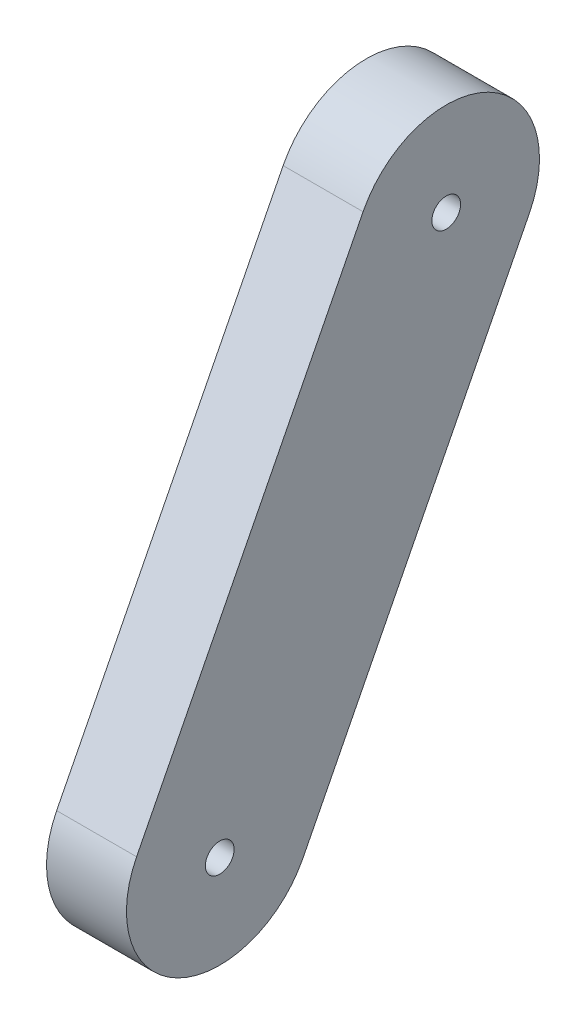
ISO-10303-21;
HEADER;
FILE_DESCRIPTION(('STEP AP214'),'2;1');
FILE_NAME('part.step','',(''),(''),'','','');
FILE_SCHEMA(('AUTOMOTIVE_DESIGN { 1 0 10303 214 1 1 1 1 }'));
ENDSEC;
DATA;
#1=APPLICATION_CONTEXT('core data for automotive mechanical design processes');
#2=APPLICATION_PROTOCOL_DEFINITION('international standard','automotive_design',2000,#1);
#3=PRODUCT_CONTEXT('',#1,'mechanical');
#4=PRODUCT('Part','Part','',(#3));
#5=PRODUCT_RELATED_PRODUCT_CATEGORY('part','',(#4));
#6=PRODUCT_DEFINITION_FORMATION('','',#4);
#7=PRODUCT_DEFINITION_CONTEXT('part definition',#1,'design');
#8=PRODUCT_DEFINITION('design','',#6,#7);
#9=PRODUCT_DEFINITION_SHAPE('','',#8);
#10=(LENGTH_UNIT() NAMED_UNIT(*) SI_UNIT(.MILLI.,.METRE.));
#11=(NAMED_UNIT(*) PLANE_ANGLE_UNIT() SI_UNIT($,.RADIAN.));
#12=(NAMED_UNIT(*) SI_UNIT($,.STERADIAN.) SOLID_ANGLE_UNIT());
#13=UNCERTAINTY_MEASURE_WITH_UNIT(LENGTH_MEASURE(1.E-05),#10,'distance_accuracy_value','');
#14=(GEOMETRIC_REPRESENTATION_CONTEXT(3) GLOBAL_UNCERTAINTY_ASSIGNED_CONTEXT((#13)) GLOBAL_UNIT_ASSIGNED_CONTEXT((#10,
#11,#12)) REPRESENTATION_CONTEXT('',''));
#15=CARTESIAN_POINT('',(0.,0.,0.));
#16=DIRECTION('',(0.,0.,1.));
#17=DIRECTION('',(1.,0.,0.));
#18=AXIS2_PLACEMENT_3D('',#15,#16,#17);
#19=CARTESIAN_POINT('',(12.827,-82.55,812.8));
#20=DIRECTION('',(1.,0.,0.));
#21=DIRECTION('',(0.,1.,0.));
#22=AXIS2_PLACEMENT_3D('',#19,#20,#21);
#23=PLANE('',#22);
#24=CARTESIAN_POINT('',(12.827,-82.55,812.8));
#25=DIRECTION('',(-1.,0.,0.));
#26=DIRECTION('',(0.,1.,0.));
#27=AXIS2_PLACEMENT_3D('',#24,#25,#26);
#28=CIRCLE('',#27,44.45);
#29=CARTESIAN_POINT('',(12.827,-62.4014943280687,852.421209209061));
#30=VERTEX_POINT('',#29);
#31=CARTESIAN_POINT('',(12.827,-102.698505671931,773.178790790939));
#32=VERTEX_POINT('',#31);
#33=EDGE_CURVE('E91',#30,#32,#28,.T.);
#34=ORIENTED_EDGE('',*,*,#33,.T.);
#35=DIRECTION('',(0.,-0.891365786480554,0.453284717028826));
#36=VECTOR('',#35,1.);
#37=CARTESIAN_POINT('',(12.827,-102.698505671931,773.178790790939));
#38=LINE('',#37,#36);
#39=CARTESIAN_POINT('',(12.8270000000001,-314.954983577613,881.117214033429));
#40=VERTEX_POINT('',#39);
#41=EDGE_CURVE('E86',#32,#40,#38,.T.);
#42=ORIENTED_EDGE('',*,*,#41,.T.);
#43=CARTESIAN_POINT('',(12.8270000000001,-294.806477905682,920.738423242489));
#44=DIRECTION('',(-1.,0.,0.));
#45=DIRECTION('',(0.,-1.,0.));
#46=AXIS2_PLACEMENT_3D('',#43,#44,#45);
#47=CIRCLE('',#46,44.45);
#48=CARTESIAN_POINT('',(12.8270000000001,-274.657972233751,960.35963245155));
#49=VERTEX_POINT('',#48);
#50=EDGE_CURVE('E89',#40,#49,#47,.T.);
#51=ORIENTED_EDGE('',*,*,#50,.T.);
#52=DIRECTION('',(0.,0.891365786480554,-0.453284717028826));
#53=VECTOR('',#52,1.);
#54=CARTESIAN_POINT('',(12.827,-62.4014943280687,852.421209209061));
#55=LINE('',#54,#53);
#56=EDGE_CURVE('E56',#49,#30,#55,.T.);
#57=ORIENTED_EDGE('',*,*,#56,.T.);
#58=EDGE_LOOP('',(#34,#42,#51,#57));
#59=FACE_BOUND('',#58,.T.);
#60=CARTESIAN_POINT('',(12.8270000000001,-294.806477905682,920.738423242489));
#61=DIRECTION('',(-1.,0.,0.));
#62=DIRECTION('',(0.,-1.,0.));
#63=AXIS2_PLACEMENT_3D('',#60,#61,#62);
#64=CIRCLE('',#63,6.84999999999997);
#65=CARTESIAN_POINT('',(12.8270000000001,-287.956477905682,920.738423242489));
#66=VERTEX_POINT('',#65);
#67=EDGE_CURVE('E106',#66,#66,#64,.T.);
#68=ORIENTED_EDGE('',*,*,#67,.F.);
#69=EDGE_LOOP('',(#68));
#70=FACE_BOUND('',#69,.T.);
#71=CARTESIAN_POINT('',(12.827,-82.55,812.8));
#72=DIRECTION('',(-1.,0.,0.));
#73=DIRECTION('',(0.,-1.,0.));
#74=AXIS2_PLACEMENT_3D('',#71,#72,#73);
#75=CIRCLE('',#74,6.84999999999997);
#76=CARTESIAN_POINT('',(12.827,-75.7,812.8));
#77=VERTEX_POINT('',#76);
#78=EDGE_CURVE('E121',#77,#77,#75,.T.);
#79=ORIENTED_EDGE('',*,*,#78,.F.);
#80=EDGE_LOOP('',(#79));
#81=FACE_BOUND('',#80,.T.);
#82=ADVANCED_FACE('F39',(#59,#70,#81),#23,.F.);
#83=CARTESIAN_POINT('',(50.927,-82.55,812.8));
#84=DIRECTION('',(1.,0.,0.));
#85=DIRECTION('',(0.,1.,0.));
#86=AXIS2_PLACEMENT_3D('',#83,#84,#85);
#87=PLANE('',#86);
#88=CARTESIAN_POINT('',(50.9270000000001,-294.806477905682,920.738423242489));
#89=DIRECTION('',(-1.,0.,0.));
#90=DIRECTION('',(0.,-1.,0.));
#91=AXIS2_PLACEMENT_3D('',#88,#89,#90);
#92=CIRCLE('',#91,6.84999999999997);
#93=CARTESIAN_POINT('',(50.9270000000001,-287.956477905682,920.738423242489));
#94=VERTEX_POINT('',#93);
#95=EDGE_CURVE('E118',#94,#94,#92,.T.);
#96=ORIENTED_EDGE('',*,*,#95,.T.);
#97=EDGE_LOOP('',(#96));
#98=FACE_BOUND('',#97,.T.);
#99=CARTESIAN_POINT('',(50.927,-82.55,812.8));
#100=DIRECTION('',(-1.,0.,0.));
#101=DIRECTION('',(0.,1.,0.));
#102=AXIS2_PLACEMENT_3D('',#99,#100,#101);
#103=CIRCLE('',#102,44.45);
#104=CARTESIAN_POINT('',(50.927,-62.4014943280686,852.421209209061));
#105=VERTEX_POINT('',#104);
#106=CARTESIAN_POINT('',(50.927,-102.698505671931,773.178790790939));
#107=VERTEX_POINT('',#106);
#108=EDGE_CURVE('E103',#105,#107,#103,.T.);
#109=ORIENTED_EDGE('',*,*,#108,.F.);
#110=DIRECTION('',(0.,0.891365786480554,-0.453284717028826));
#111=VECTOR('',#110,1.);
#112=CARTESIAN_POINT('',(50.927,-62.4014943280686,852.421209209061));
#113=LINE('',#112,#111);
#114=CARTESIAN_POINT('',(50.9270000000001,-274.657972233751,960.35963245155));
#115=VERTEX_POINT('',#114);
#116=EDGE_CURVE('E79',#115,#105,#113,.T.);
#117=ORIENTED_EDGE('',*,*,#116,.F.);
#118=CARTESIAN_POINT('',(50.9270000000001,-294.806477905682,920.738423242489));
#119=DIRECTION('',(-1.,0.,0.));
#120=DIRECTION('',(0.,-1.,0.));
#121=AXIS2_PLACEMENT_3D('',#118,#119,#120);
#122=CIRCLE('',#121,44.45);
#123=CARTESIAN_POINT('',(50.9270000000001,-314.954983577613,881.117214033429));
#124=VERTEX_POINT('',#123);
#125=EDGE_CURVE('E73',#124,#115,#122,.T.);
#126=ORIENTED_EDGE('',*,*,#125,.F.);
#127=DIRECTION('',(0.,-0.891365786480554,0.453284717028826));
#128=VECTOR('',#127,1.);
#129=CARTESIAN_POINT('',(50.927,-102.698505671931,773.178790790939));
#130=LINE('',#129,#128);
#131=EDGE_CURVE('E95',#107,#124,#130,.T.);
#132=ORIENTED_EDGE('',*,*,#131,.F.);
#133=EDGE_LOOP('',(#109,#117,#126,#132));
#134=FACE_BOUND('',#133,.T.);
#135=CARTESIAN_POINT('',(50.927,-82.55,812.8));
#136=DIRECTION('',(-1.,0.,0.));
#137=DIRECTION('',(0.,-1.,0.));
#138=AXIS2_PLACEMENT_3D('',#135,#136,#137);
#139=CIRCLE('',#138,6.84999999999997);
#140=CARTESIAN_POINT('',(50.927,-75.7,812.8));
#141=VERTEX_POINT('',#140);
#142=EDGE_CURVE('E124',#141,#141,#139,.T.);
#143=ORIENTED_EDGE('',*,*,#142,.T.);
#144=EDGE_LOOP('',(#143));
#145=FACE_BOUND('',#144,.T.);
#146=ADVANCED_FACE('F114',(#98,#134,#145),#87,.T.);
#147=CARTESIAN_POINT('',(12.827,-82.55,812.8));
#148=DIRECTION('',(1.,0.,0.));
#149=DIRECTION('',(0.,1.,0.));
#150=AXIS2_PLACEMENT_3D('',#147,#148,#149);
#151=CYLINDRICAL_SURFACE('',#150,44.45);
#152=ORIENTED_EDGE('',*,*,#108,.T.);
#153=DIRECTION('',(1.,0.,0.));
#154=VECTOR('',#153,1.);
#155=CARTESIAN_POINT('',(12.827,-102.698505671931,773.178790790939));
#156=LINE('',#155,#154);
#157=EDGE_CURVE('E11',#32,#107,#156,.T.);
#158=ORIENTED_EDGE('',*,*,#157,.F.);
#159=ORIENTED_EDGE('',*,*,#33,.F.);
#160=DIRECTION('',(1.,0.,0.));
#161=VECTOR('',#160,1.);
#162=CARTESIAN_POINT('',(12.827,-62.4014943280687,852.421209209061));
#163=LINE('',#162,#161);
#164=EDGE_CURVE('E99',#30,#105,#163,.T.);
#165=ORIENTED_EDGE('',*,*,#164,.T.);
#166=EDGE_LOOP('',(#152,#158,#159,#165));
#167=FACE_BOUND('',#166,.T.);
#168=ADVANCED_FACE('F41',(#167),#151,.T.);
#169=CARTESIAN_POINT('',(12.827,-102.698505671931,773.178790790939));
#170=DIRECTION('',(0.,0.453284717028826,0.891365786480554));
#171=DIRECTION('',(0.,-0.891365786480554,0.453284717028826));
#172=AXIS2_PLACEMENT_3D('',#169,#170,#171);
#173=PLANE('',#172);
#174=ORIENTED_EDGE('',*,*,#131,.T.);
#175=DIRECTION('',(1.,0.,0.));
#176=VECTOR('',#175,1.);
#177=CARTESIAN_POINT('',(12.8270000000001,-314.954983577613,881.117214033429));
#178=LINE('',#177,#176);
#179=EDGE_CURVE('E48',#40,#124,#178,.T.);
#180=ORIENTED_EDGE('',*,*,#179,.F.);
#181=ORIENTED_EDGE('',*,*,#41,.F.);
#182=ORIENTED_EDGE('',*,*,#157,.T.);
#183=EDGE_LOOP('',(#174,#180,#181,#182));
#184=FACE_BOUND('',#183,.T.);
#185=ADVANCED_FACE('F94',(#184),#173,.F.);
#186=CARTESIAN_POINT('',(12.8270000000001,-294.806477905682,920.738423242489));
#187=DIRECTION('',(1.,0.,0.));
#188=DIRECTION('',(0.,1.,0.));
#189=AXIS2_PLACEMENT_3D('',#186,#187,#188);
#190=CYLINDRICAL_SURFACE('',#189,44.45);
#191=ORIENTED_EDGE('',*,*,#125,.T.);
#192=DIRECTION('',(1.,0.,0.));
#193=VECTOR('',#192,1.);
#194=CARTESIAN_POINT('',(12.8270000000001,-274.657972233751,960.35963245155));
#195=LINE('',#194,#193);
#196=EDGE_CURVE('E96',#49,#115,#195,.T.);
#197=ORIENTED_EDGE('',*,*,#196,.F.);
#198=ORIENTED_EDGE('',*,*,#50,.F.);
#199=ORIENTED_EDGE('',*,*,#179,.T.);
#200=EDGE_LOOP('',(#191,#197,#198,#199));
#201=FACE_BOUND('',#200,.T.);
#202=ADVANCED_FACE('F97',(#201),#190,.T.);
#203=CARTESIAN_POINT('',(12.827,-62.4014943280687,852.421209209061));
#204=DIRECTION('',(0.,-0.453284717028826,-0.891365786480554));
#205=DIRECTION('',(0.,0.891365786480554,-0.453284717028826));
#206=AXIS2_PLACEMENT_3D('',#203,#204,#205);
#207=PLANE('',#206);
#208=ORIENTED_EDGE('',*,*,#116,.T.);
#209=ORIENTED_EDGE('',*,*,#164,.F.);
#210=ORIENTED_EDGE('',*,*,#56,.F.);
#211=ORIENTED_EDGE('',*,*,#196,.T.);
#212=EDGE_LOOP('',(#208,#209,#210,#211));
#213=FACE_BOUND('',#212,.T.);
#214=ADVANCED_FACE('F111',(#213),#207,.F.);
#215=CARTESIAN_POINT('',(12.8270000000001,-294.806477905682,920.738423242489));
#216=DIRECTION('',(1.,0.,0.));
#217=DIRECTION('',(0.,1.,0.));
#218=AXIS2_PLACEMENT_3D('',#215,#216,#217);
#219=CYLINDRICAL_SURFACE('',#218,6.84999999999997);
#220=CARTESIAN_POINT('',(12.8270000000001,-287.956477905682,920.738423242489));
#221=CARTESIAN_POINT('',(13.2238750000001,-287.956477905682,920.738423242489));
#222=CARTESIAN_POINT('',(13.6207500000001,-287.956477905682,920.738423242489));
#223=CARTESIAN_POINT('',(14.4145000000001,-287.956477905682,920.738423242489));
#224=CARTESIAN_POINT('',(14.8113750000001,-287.956477905682,920.738423242489));
#225=CARTESIAN_POINT('',(15.6051250000001,-287.956477905682,920.738423242489));
#226=CARTESIAN_POINT('',(16.0020000000001,-287.956477905682,920.738423242489));
#227=CARTESIAN_POINT('',(16.7957500000001,-287.956477905682,920.738423242489));
#228=CARTESIAN_POINT('',(17.1926250000001,-287.956477905682,920.738423242489));
#229=CARTESIAN_POINT('',(17.9863750000001,-287.956477905682,920.738423242489));
#230=CARTESIAN_POINT('',(18.3832500000001,-287.956477905682,920.738423242489));
#231=CARTESIAN_POINT('',(19.1770000000001,-287.956477905682,920.738423242489));
#232=CARTESIAN_POINT('',(19.5738750000001,-287.956477905682,920.738423242489));
#233=CARTESIAN_POINT('',(20.3676250000001,-287.956477905682,920.738423242489));
#234=CARTESIAN_POINT('',(20.7645000000001,-287.956477905682,920.738423242489));
#235=CARTESIAN_POINT('',(21.5582500000001,-287.956477905682,920.738423242489));
#236=CARTESIAN_POINT('',(21.9551250000001,-287.956477905682,920.738423242489));
#237=CARTESIAN_POINT('',(22.7488750000001,-287.956477905682,920.738423242489));
#238=CARTESIAN_POINT('',(23.1457500000001,-287.956477905682,920.738423242489));
#239=CARTESIAN_POINT('',(23.9395000000001,-287.956477905682,920.738423242489));
#240=CARTESIAN_POINT('',(24.3363750000001,-287.956477905682,920.738423242489));
#241=CARTESIAN_POINT('',(25.1301250000001,-287.956477905682,920.738423242489));
#242=CARTESIAN_POINT('',(25.5270000000001,-287.956477905682,920.738423242489));
#243=CARTESIAN_POINT('',(26.3207500000001,-287.956477905682,920.738423242489));
#244=CARTESIAN_POINT('',(26.7176250000001,-287.956477905682,920.738423242489));
#245=CARTESIAN_POINT('',(27.5113750000001,-287.956477905682,920.738423242489));
#246=CARTESIAN_POINT('',(27.9082500000001,-287.956477905682,920.738423242489));
#247=CARTESIAN_POINT('',(28.7020000000001,-287.956477905682,920.738423242489));
#248=CARTESIAN_POINT('',(29.0988750000001,-287.956477905682,920.738423242489));
#249=CARTESIAN_POINT('',(29.8926250000001,-287.956477905682,920.738423242489));
#250=CARTESIAN_POINT('',(30.2895000000001,-287.956477905682,920.738423242489));
#251=CARTESIAN_POINT('',(31.0832500000001,-287.956477905682,920.738423242489));
#252=CARTESIAN_POINT('',(31.4801250000001,-287.956477905682,920.738423242489));
#253=CARTESIAN_POINT('',(32.2738750000001,-287.956477905682,920.738423242489));
#254=CARTESIAN_POINT('',(32.6707500000001,-287.956477905682,920.738423242489));
#255=CARTESIAN_POINT('',(33.4645000000001,-287.956477905682,920.738423242489));
#256=CARTESIAN_POINT('',(33.8613750000001,-287.956477905682,920.738423242489));
#257=CARTESIAN_POINT('',(34.6551250000001,-287.956477905682,920.738423242489));
#258=CARTESIAN_POINT('',(35.0520000000001,-287.956477905682,920.738423242489));
#259=CARTESIAN_POINT('',(35.8457500000001,-287.956477905682,920.738423242489));
#260=CARTESIAN_POINT('',(36.2426250000001,-287.956477905682,920.738423242489));
#261=CARTESIAN_POINT('',(37.0363750000001,-287.956477905682,920.738423242489));
#262=CARTESIAN_POINT('',(37.4332500000001,-287.956477905682,920.738423242489));
#263=CARTESIAN_POINT('',(38.2270000000001,-287.956477905682,920.738423242489));
#264=CARTESIAN_POINT('',(38.6238750000001,-287.956477905682,920.738423242489));
#265=CARTESIAN_POINT('',(39.4176250000001,-287.956477905682,920.738423242489));
#266=CARTESIAN_POINT('',(39.8145000000001,-287.956477905682,920.738423242489));
#267=CARTESIAN_POINT('',(40.6082500000001,-287.956477905682,920.738423242489));
#268=CARTESIAN_POINT('',(41.0051250000001,-287.956477905682,920.738423242489));
#269=CARTESIAN_POINT('',(41.7988750000001,-287.956477905682,920.738423242489));
#270=CARTESIAN_POINT('',(42.1957500000001,-287.956477905682,920.738423242489));
#271=CARTESIAN_POINT('',(42.9895000000001,-287.956477905682,920.738423242489));
#272=CARTESIAN_POINT('',(43.3863750000001,-287.956477905682,920.738423242489));
#273=CARTESIAN_POINT('',(44.1801250000001,-287.956477905682,920.738423242489));
#274=CARTESIAN_POINT('',(44.5770000000001,-287.956477905682,920.738423242489));
#275=CARTESIAN_POINT('',(45.3707500000001,-287.956477905682,920.738423242489));
#276=CARTESIAN_POINT('',(45.7676250000001,-287.956477905682,920.738423242489));
#277=CARTESIAN_POINT('',(46.5613750000001,-287.956477905682,920.738423242489));
#278=CARTESIAN_POINT('',(46.9582500000001,-287.956477905682,920.738423242489));
#279=CARTESIAN_POINT('',(47.7520000000001,-287.956477905682,920.738423242489));
#280=CARTESIAN_POINT('',(48.1488750000001,-287.956477905682,920.738423242489));
#281=CARTESIAN_POINT('',(48.9426250000001,-287.956477905682,920.738423242489));
#282=CARTESIAN_POINT('',(49.3395000000001,-287.956477905682,920.738423242489));
#283=CARTESIAN_POINT('',(50.1332500000001,-287.956477905682,920.738423242489));
#284=CARTESIAN_POINT('',(50.5301250000001,-287.956477905682,920.738423242489));
#285=CARTESIAN_POINT('',(50.9270000000001,-287.956477905682,920.738423242489));
#286=B_SPLINE_CURVE_WITH_KNOTS('',3,(#220,#221,#222,#223,#224,#225,#226,#227,#228,#229,#230,
#231,#232,#233,#234,#235,#236,#237,#238,#239,#240,#241,#242,#243,#244,#245,#246,#247,#248,#249,
#250,#251,#252,#253,#254,#255,#256,#257,#258,#259,#260,#261,#262,#263,#264,#265,#266,#267,#268,
#269,#270,#271,#272,#273,#274,#275,#276,#277,#278,#279,#280,#281,#282,#283,#284,#285),
.UNSPECIFIED.,.F.,.F.,(4,2,2,2,2,2,2,2,2,2,2,2,2,2,2,2,2,2,2,2,2,2,2,2,2,2,2,2,2,2,2,2,4),(0.,
1.190625,2.38125,3.571875,4.7625,5.953125,7.14375,8.334375,9.525,10.715625,11.90625,13.096875,
14.2875,15.478125,16.66875,17.859375,19.05,20.240625,21.43125,22.621875,23.8125,25.003125,
26.19375,27.384375,28.575,29.765625,30.95625,32.146875,33.3375,34.528125,35.71875,36.909375,
38.1),.UNSPECIFIED.);
#287=EDGE_CURVE('BSEAM141',#66,#94,#286,.T.);
#288=ORIENTED_EDGE('',*,*,#67,.T.);
#289=ORIENTED_EDGE('',*,*,#95,.F.);
#290=ORIENTED_EDGE('',*,*,#287,.T.);
#291=ORIENTED_EDGE('',*,*,#287,.F.);
#292=EDGE_LOOP('',(#288,#290,#289,#291));
#293=FACE_BOUND('',#292,.T.);
#294=ADVANCED_FACE('F141',(#293),#219,.F.);
#295=CARTESIAN_POINT('',(12.827,-82.55,812.8));
#296=DIRECTION('',(1.,0.,0.));
#297=DIRECTION('',(0.,1.,0.));
#298=AXIS2_PLACEMENT_3D('',#295,#296,#297);
#299=CYLINDRICAL_SURFACE('',#298,6.84999999999997);
#300=CARTESIAN_POINT('',(12.827,-75.7,812.8));
#301=CARTESIAN_POINT('',(13.223875,-75.7,812.8));
#302=CARTESIAN_POINT('',(13.62075,-75.7,812.8));
#303=CARTESIAN_POINT('',(14.4145,-75.7,812.8));
#304=CARTESIAN_POINT('',(14.811375,-75.7,812.8));
#305=CARTESIAN_POINT('',(15.605125,-75.7,812.8));
#306=CARTESIAN_POINT('',(16.002,-75.7,812.8));
#307=CARTESIAN_POINT('',(16.79575,-75.7,812.8));
#308=CARTESIAN_POINT('',(17.192625,-75.7,812.8));
#309=CARTESIAN_POINT('',(17.986375,-75.7,812.8));
#310=CARTESIAN_POINT('',(18.38325,-75.7,812.8));
#311=CARTESIAN_POINT('',(19.177,-75.7,812.8));
#312=CARTESIAN_POINT('',(19.573875,-75.7,812.8));
#313=CARTESIAN_POINT('',(20.367625,-75.7,812.8));
#314=CARTESIAN_POINT('',(20.7645,-75.7,812.8));
#315=CARTESIAN_POINT('',(21.55825,-75.7,812.8));
#316=CARTESIAN_POINT('',(21.955125,-75.7,812.8));
#317=CARTESIAN_POINT('',(22.748875,-75.7,812.8));
#318=CARTESIAN_POINT('',(23.14575,-75.7,812.8));
#319=CARTESIAN_POINT('',(23.9395,-75.7,812.8));
#320=CARTESIAN_POINT('',(24.336375,-75.7,812.8));
#321=CARTESIAN_POINT('',(25.130125,-75.7,812.8));
#322=CARTESIAN_POINT('',(25.527,-75.7,812.8));
#323=CARTESIAN_POINT('',(26.32075,-75.7,812.8));
#324=CARTESIAN_POINT('',(26.717625,-75.7,812.8));
#325=CARTESIAN_POINT('',(27.511375,-75.7,812.8));
#326=CARTESIAN_POINT('',(27.90825,-75.7,812.8));
#327=CARTESIAN_POINT('',(28.702,-75.7,812.8));
#328=CARTESIAN_POINT('',(29.098875,-75.7,812.8));
#329=CARTESIAN_POINT('',(29.892625,-75.7,812.8));
#330=CARTESIAN_POINT('',(30.2895,-75.7,812.8));
#331=CARTESIAN_POINT('',(31.08325,-75.7,812.8));
#332=CARTESIAN_POINT('',(31.480125,-75.7,812.8));
#333=CARTESIAN_POINT('',(32.273875,-75.7,812.8));
#334=CARTESIAN_POINT('',(32.67075,-75.7,812.8));
#335=CARTESIAN_POINT('',(33.4645,-75.7,812.8));
#336=CARTESIAN_POINT('',(33.861375,-75.7,812.8));
#337=CARTESIAN_POINT('',(34.655125,-75.7,812.8));
#338=CARTESIAN_POINT('',(35.052,-75.7,812.8));
#339=CARTESIAN_POINT('',(35.84575,-75.7,812.8));
#340=CARTESIAN_POINT('',(36.242625,-75.7,812.8));
#341=CARTESIAN_POINT('',(37.036375,-75.7,812.8));
#342=CARTESIAN_POINT('',(37.43325,-75.7,812.8));
#343=CARTESIAN_POINT('',(38.227,-75.7,812.8));
#344=CARTESIAN_POINT('',(38.623875,-75.7,812.8));
#345=CARTESIAN_POINT('',(39.417625,-75.7,812.8));
#346=CARTESIAN_POINT('',(39.8145,-75.7,812.8));
#347=CARTESIAN_POINT('',(40.60825,-75.7,812.8));
#348=CARTESIAN_POINT('',(41.005125,-75.7,812.8));
#349=CARTESIAN_POINT('',(41.798875,-75.7,812.8));
#350=CARTESIAN_POINT('',(42.19575,-75.7,812.8));
#351=CARTESIAN_POINT('',(42.9895,-75.7,812.8));
#352=CARTESIAN_POINT('',(43.386375,-75.7,812.8));
#353=CARTESIAN_POINT('',(44.180125,-75.7,812.8));
#354=CARTESIAN_POINT('',(44.577,-75.7,812.8));
#355=CARTESIAN_POINT('',(45.37075,-75.7,812.8));
#356=CARTESIAN_POINT('',(45.767625,-75.7,812.8));
#357=CARTESIAN_POINT('',(46.561375,-75.7,812.8));
#358=CARTESIAN_POINT('',(46.95825,-75.7,812.8));
#359=CARTESIAN_POINT('',(47.752,-75.7,812.8));
#360=CARTESIAN_POINT('',(48.148875,-75.7,812.8));
#361=CARTESIAN_POINT('',(48.942625,-75.7,812.8));
#362=CARTESIAN_POINT('',(49.3395,-75.7,812.8));
#363=CARTESIAN_POINT('',(50.13325,-75.7,812.8));
#364=CARTESIAN_POINT('',(50.530125,-75.7,812.8));
#365=CARTESIAN_POINT('',(50.927,-75.7,812.8));
#366=B_SPLINE_CURVE_WITH_KNOTS('',3,(#300,#301,#302,#303,#304,#305,#306,#307,#308,#309,#310,
#311,#312,#313,#314,#315,#316,#317,#318,#319,#320,#321,#322,#323,#324,#325,#326,#327,#328,#329,
#330,#331,#332,#333,#334,#335,#336,#337,#338,#339,#340,#341,#342,#343,#344,#345,#346,#347,#348,
#349,#350,#351,#352,#353,#354,#355,#356,#357,#358,#359,#360,#361,#362,#363,#364,#365),
.UNSPECIFIED.,.F.,.F.,(4,2,2,2,2,2,2,2,2,2,2,2,2,2,2,2,2,2,2,2,2,2,2,2,2,2,2,2,2,2,2,2,4),(0.,
1.190625,2.38125,3.571875,4.7625,5.953125,7.14375,8.334375,9.525,10.715625,11.90625,13.096875,
14.2875,15.478125,16.66875,17.859375,19.05,20.240625,21.43125,22.621875,23.8125,25.003125,
26.19375,27.384375,28.575,29.765625,30.95625,32.146875,33.3375,34.528125,35.71875,36.909375,
38.1),.UNSPECIFIED.);
#367=EDGE_CURVE('BSEAM130',#77,#141,#366,.T.);
#368=ORIENTED_EDGE('',*,*,#78,.T.);
#369=ORIENTED_EDGE('',*,*,#142,.F.);
#370=ORIENTED_EDGE('',*,*,#367,.T.);
#371=ORIENTED_EDGE('',*,*,#367,.F.);
#372=EDGE_LOOP('',(#368,#370,#369,#371));
#373=FACE_BOUND('',#372,.T.);
#374=ADVANCED_FACE('F130',(#373),#299,.F.);
#375=CLOSED_SHELL('',(#82,#146,#168,#185,#202,#214,#294,#374));
#376=MANIFOLD_SOLID_BREP('B2',#375);
#377=ADVANCED_BREP_SHAPE_REPRESENTATION('',(#18,#376),#14);
#378=SHAPE_DEFINITION_REPRESENTATION(#9,#377);
ENDSEC;
END-ISO-10303-21;
